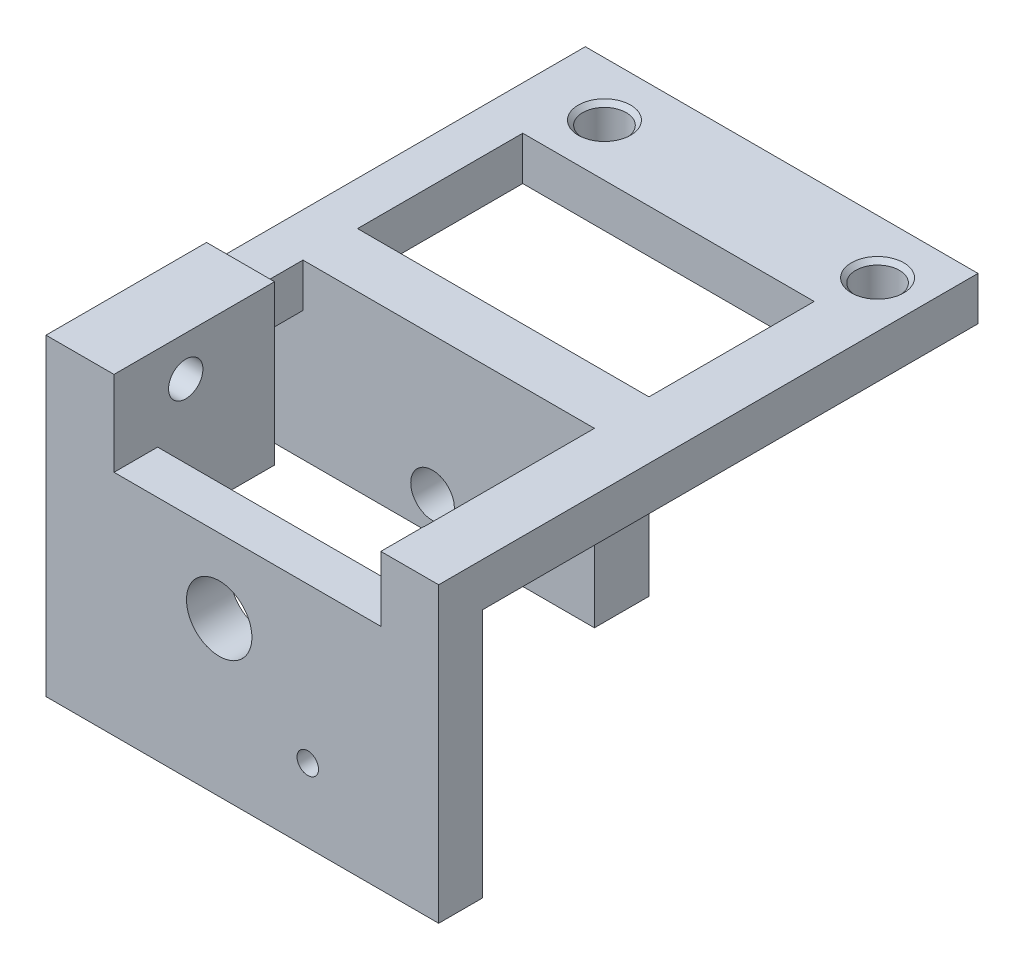
ISO-10303-21;
HEADER;
FILE_DESCRIPTION(('STEP AP214'),'2;1');
FILE_NAME('part.step','',(''),(''),'','','');
FILE_SCHEMA(('AUTOMOTIVE_DESIGN { 1 0 10303 214 1 1 1 1 }'));
ENDSEC;
DATA;
#1=APPLICATION_CONTEXT('core data for automotive mechanical design processes');
#2=APPLICATION_PROTOCOL_DEFINITION('international standard','automotive_design',2000,#1);
#3=PRODUCT_CONTEXT('',#1,'mechanical');
#4=PRODUCT('Part','Part','',(#3));
#5=PRODUCT_RELATED_PRODUCT_CATEGORY('part','',(#4));
#6=PRODUCT_DEFINITION_FORMATION('','',#4);
#7=PRODUCT_DEFINITION_CONTEXT('part definition',#1,'design');
#8=PRODUCT_DEFINITION('design','',#6,#7);
#9=PRODUCT_DEFINITION_SHAPE('','',#8);
#10=(LENGTH_UNIT() NAMED_UNIT(*) SI_UNIT(.MILLI.,.METRE.));
#11=(NAMED_UNIT(*) PLANE_ANGLE_UNIT() SI_UNIT($,.RADIAN.));
#12=(NAMED_UNIT(*) SI_UNIT($,.STERADIAN.) SOLID_ANGLE_UNIT());
#13=UNCERTAINTY_MEASURE_WITH_UNIT(LENGTH_MEASURE(1.E-05),#10,'distance_accuracy_value','');
#14=(GEOMETRIC_REPRESENTATION_CONTEXT(3) GLOBAL_UNCERTAINTY_ASSIGNED_CONTEXT((#13)) GLOBAL_UNIT_ASSIGNED_CONTEXT((#10,
#11,#12)) REPRESENTATION_CONTEXT('',''));
#15=CARTESIAN_POINT('',(0.,0.,0.));
#16=DIRECTION('',(0.,0.,1.));
#17=DIRECTION('',(1.,0.,0.));
#18=AXIS2_PLACEMENT_3D('',#15,#16,#17);
#19=CARTESIAN_POINT('',(-18.8578713163455,22.7197449567817,0.));
#20=DIRECTION('',(1.,0.,0.));
#21=DIRECTION('',(0.,0.,-1.));
#22=AXIS2_PLACEMENT_3D('',#19,#20,#21);
#23=PLANE('',#22);
#24=DIRECTION('',(0.,-1.,0.));
#25=VECTOR('',#24,1.);
#26=CARTESIAN_POINT('',(-18.8578713163455,22.7197449567817,-31.0499999999992));
#27=LINE('',#26,#25);
#28=CARTESIAN_POINT('',(-18.8578713163455,29.0697449567817,-31.0499999999992));
#29=VERTEX_POINT('',#28);
#30=CARTESIAN_POINT('',(-18.8578713163455,22.7197449567817,-31.0499999999992));
#31=VERTEX_POINT('',#30);
#32=EDGE_CURVE('E242',#29,#31,#27,.T.);
#33=ORIENTED_EDGE('',*,*,#32,.F.);
#34=DIRECTION('',(0.,0.,-1.));
#35=VECTOR('',#34,1.);
#36=CARTESIAN_POINT('',(-18.8578713163455,29.0697449567817,0.));
#37=LINE('',#36,#35);
#38=CARTESIAN_POINT('',(-18.8578713163455,29.0697449567817,-23.368));
#39=VERTEX_POINT('',#38);
#40=EDGE_CURVE('E313',#39,#29,#37,.T.);
#41=ORIENTED_EDGE('',*,*,#40,.F.);
#42=DIRECTION('',(0.,1.,0.));
#43=VECTOR('',#42,1.);
#44=CARTESIAN_POINT('',(-18.8578713163455,0.,-23.368));
#45=LINE('',#44,#43);
#46=CARTESIAN_POINT('',(-18.8578713163455,22.7197449567817,-23.368));
#47=VERTEX_POINT('',#46);
#48=EDGE_CURVE('E412',#47,#39,#45,.T.);
#49=ORIENTED_EDGE('',*,*,#48,.F.);
#50=DIRECTION('',(0.,0.,-1.));
#51=VECTOR('',#50,1.);
#52=CARTESIAN_POINT('',(-18.8578713163455,22.7197449567817,0.));
#53=LINE('',#52,#51);
#54=EDGE_CURVE('E304',#47,#31,#53,.T.);
#55=ORIENTED_EDGE('',*,*,#54,.T.);
#56=EDGE_LOOP('',(#33,#41,#49,#55));
#57=FACE_BOUND('',#56,.T.);
#58=ADVANCED_FACE('F37',(#57),#23,.T.);
#59=CARTESIAN_POINT('',(0.,22.7197449567817,0.));
#60=DIRECTION('',(0.,1.,0.));
#61=DIRECTION('',(0.,0.,1.));
#62=AXIS2_PLACEMENT_3D('',#59,#60,#61);
#63=PLANE('',#62);
#64=DIRECTION('',(0.,0.,1.));
#65=VECTOR('',#64,1.);
#66=CARTESIAN_POINT('',(-25.2078713163455,22.7197449567817,0.));
#67=LINE('',#66,#65);
#68=CARTESIAN_POINT('',(-25.2078713163455,22.7197449567817,-31.0499999999992));
#69=VERTEX_POINT('',#68);
#70=CARTESIAN_POINT('',(-25.2078713163455,22.7197449567817,-23.368));
#71=VERTEX_POINT('',#70);
#72=EDGE_CURVE('E307',#69,#71,#67,.T.);
#73=ORIENTED_EDGE('',*,*,#72,.F.);
#74=DIRECTION('',(1.,0.,0.));
#75=VECTOR('',#74,1.);
#76=CARTESIAN_POINT('',(0.,22.7197449567817,-31.0499999999992));
#77=LINE('',#76,#75);
#78=EDGE_CURVE('E239',#69,#31,#77,.T.);
#79=ORIENTED_EDGE('',*,*,#78,.T.);
#80=ORIENTED_EDGE('',*,*,#54,.F.);
#81=DIRECTION('',(-1.,0.,0.));
#82=VECTOR('',#81,1.);
#83=CARTESIAN_POINT('',(0.,22.7197449567817,-23.368));
#84=LINE('',#83,#82);
#85=EDGE_CURVE('E415',#47,#71,#84,.T.);
#86=ORIENTED_EDGE('',*,*,#85,.T.);
#87=EDGE_LOOP('',(#73,#79,#80,#86));
#88=FACE_BOUND('',#87,.T.);
#89=ADVANCED_FACE('F442',(#88),#63,.F.);
#90=CARTESIAN_POINT('',(23.5601286836545,22.7197449567817,0.));
#91=DIRECTION('',(-1.,0.,0.));
#92=DIRECTION('',(0.,0.,1.));
#93=AXIS2_PLACEMENT_3D('',#90,#91,#92);
#94=PLANE('',#93);
#95=DIRECTION('',(0.,1.,0.));
#96=VECTOR('',#95,1.);
#97=CARTESIAN_POINT('',(23.5601286836545,22.7197449567817,-31.0499999999993));
#98=LINE('',#97,#96);
#99=CARTESIAN_POINT('',(23.5601286836545,22.7197449567817,-31.0499999999993));
#100=VERTEX_POINT('',#99);
#101=CARTESIAN_POINT('',(23.5601286836545,29.0697449567817,-31.0499999999992));
#102=VERTEX_POINT('',#101);
#103=EDGE_CURVE('E11',#100,#102,#98,.T.);
#104=ORIENTED_EDGE('',*,*,#103,.F.);
#105=DIRECTION('',(0.,0.,1.));
#106=VECTOR('',#105,1.);
#107=CARTESIAN_POINT('',(23.5601286836545,22.7197449567817,0.));
#108=LINE('',#107,#106);
#109=CARTESIAN_POINT('',(23.5601286836545,22.7197449567817,-6.35));
#110=VERTEX_POINT('',#109);
#111=EDGE_CURVE('E289',#100,#110,#108,.T.);
#112=ORIENTED_EDGE('',*,*,#111,.T.);
#113=DIRECTION('',(0.,1.,0.));
#114=VECTOR('',#113,1.);
#115=CARTESIAN_POINT('',(23.5601286836545,0.,-6.35));
#116=LINE('',#115,#114);
#117=CARTESIAN_POINT('',(23.5601286836545,29.0697449567817,-6.35));
#118=VERTEX_POINT('',#117);
#119=EDGE_CURVE('E300',#110,#118,#116,.T.);
#120=ORIENTED_EDGE('',*,*,#119,.T.);
#121=DIRECTION('',(0.,0.,1.));
#122=VECTOR('',#121,1.);
#123=CARTESIAN_POINT('',(23.5601286836545,29.0697449567817,0.));
#124=LINE('',#123,#122);
#125=EDGE_CURVE('E286',#102,#118,#124,.T.);
#126=ORIENTED_EDGE('',*,*,#125,.F.);
#127=EDGE_LOOP('',(#104,#112,#120,#126));
#128=FACE_BOUND('',#127,.T.);
#129=ADVANCED_FACE('F449',(#128),#94,.T.);
#130=CARTESIAN_POINT('',(0.,0.,-23.368));
#131=DIRECTION('',(0.,0.,1.));
#132=DIRECTION('',(1.,0.,0.));
#133=AXIS2_PLACEMENT_3D('',#130,#131,#132);
#134=PLANE('',#133);
#135=ORIENTED_EDGE('',*,*,#85,.F.);
#136=ORIENTED_EDGE('',*,*,#48,.T.);
#137=DIRECTION('',(-1.,0.,0.));
#138=VECTOR('',#137,1.);
#139=CARTESIAN_POINT('',(0.,29.0697449567817,-23.368));
#140=LINE('',#139,#138);
#141=CARTESIAN_POINT('',(-25.2078713163455,29.0697449567817,-23.368));
#142=VERTEX_POINT('',#141);
#143=EDGE_CURVE('E392',#39,#142,#140,.T.);
#144=ORIENTED_EDGE('',*,*,#143,.T.);
#145=DIRECTION('',(0.,-1.,0.));
#146=VECTOR('',#145,1.);
#147=CARTESIAN_POINT('',(-25.2078713163455,0.,-23.368));
#148=LINE('',#147,#146);
#149=CARTESIAN_POINT('',(-25.2078713163455,31.9581967213115,-23.368));
#150=VERTEX_POINT('',#149);
#151=EDGE_CURVE('E325',#150,#142,#148,.T.);
#152=ORIENTED_EDGE('',*,*,#151,.F.);
#153=DIRECTION('',(-1.,0.,0.));
#154=VECTOR('',#153,1.);
#155=CARTESIAN_POINT('',(0.,31.9581967213115,-23.368));
#156=LINE('',#155,#154);
#157=CARTESIAN_POINT('',(-15.3109469053674,31.9581967213115,-23.368));
#158=VERTEX_POINT('',#157);
#159=EDGE_CURVE('E321',#158,#150,#156,.T.);
#160=ORIENTED_EDGE('',*,*,#159,.F.);
#161=DIRECTION('',(0.,-1.,0.));
#162=VECTOR('',#161,1.);
#163=CARTESIAN_POINT('',(-15.3109469053674,0.,-23.368));
#164=LINE('',#163,#162);
#165=CARTESIAN_POINT('',(-15.3109469053674,8.84419672131148,-23.368));
#166=VERTEX_POINT('',#165);
#167=EDGE_CURVE('E319',#158,#166,#164,.T.);
#168=ORIENTED_EDGE('',*,*,#167,.T.);
#169=DIRECTION('',(-1.,0.,0.));
#170=VECTOR('',#169,1.);
#171=CARTESIAN_POINT('',(0.,8.84419672131148,-23.368));
#172=LINE('',#171,#170);
#173=CARTESIAN_POINT('',(-25.2078713163455,8.84419672131148,-23.368));
#174=VERTEX_POINT('',#173);
#175=EDGE_CURVE('E312',#166,#174,#172,.T.);
#176=ORIENTED_EDGE('',*,*,#175,.T.);
#177=EDGE_CURVE('E324',#71,#174,#148,.T.);
#178=ORIENTED_EDGE('',*,*,#177,.F.);
#179=EDGE_LOOP('',(#135,#136,#144,#152,#160,#168,#176,#178));
#180=FACE_BOUND('',#179,.T.);
#181=ADVANCED_FACE('F546',(#180),#134,.F.);
#182=CARTESIAN_POINT('',(0.,0.,-6.35));
#183=DIRECTION('',(0.,0.,-1.));
#184=DIRECTION('',(-1.,0.,0.));
#185=AXIS2_PLACEMENT_3D('',#182,#183,#184);
#186=PLANE('',#185);
#187=ORIENTED_EDGE('',*,*,#119,.F.);
#188=DIRECTION('',(1.,0.,0.));
#189=VECTOR('',#188,1.);
#190=CARTESIAN_POINT('',(0.,22.7197449567817,-6.35));
#191=LINE('',#190,#189);
#192=CARTESIAN_POINT('',(31.9421286836545,22.7197449567817,-6.35));
#193=VERTEX_POINT('',#192);
#194=EDGE_CURVE('E294',#110,#193,#191,.T.);
#195=ORIENTED_EDGE('',*,*,#194,.T.);
#196=DIRECTION('',(0.,1.,0.));
#197=VECTOR('',#196,1.);
#198=CARTESIAN_POINT('',(31.9421286836545,29.0697449567817,-6.35));
#199=LINE('',#198,#197);
#200=CARTESIAN_POINT('',(31.9421286836545,-13.6022550432183,-6.35));
#201=VERTEX_POINT('',#200);
#202=EDGE_CURVE('E358',#201,#193,#199,.T.);
#203=ORIENTED_EDGE('',*,*,#202,.F.);
#204=DIRECTION('',(1.,0.,0.));
#205=VECTOR('',#204,1.);
#206=CARTESIAN_POINT('',(-25.2078713163455,-13.6022550432183,-6.35));
#207=LINE('',#206,#205);
#208=CARTESIAN_POINT('',(-25.2078713163455,-13.6022550432183,-6.35));
#209=VERTEX_POINT('',#208);
#210=EDGE_CURVE('E354',#209,#201,#207,.T.);
#211=ORIENTED_EDGE('',*,*,#210,.F.);
#212=DIRECTION('',(0.,-1.,0.));
#213=VECTOR('',#212,1.);
#214=CARTESIAN_POINT('',(-25.2078713163455,8.84419672131148,-6.35));
#215=LINE('',#214,#213);
#216=CARTESIAN_POINT('',(-25.2078713163455,8.84419672131148,-6.35));
#217=VERTEX_POINT('',#216);
#218=EDGE_CURVE('E352',#217,#209,#215,.T.);
#219=ORIENTED_EDGE('',*,*,#218,.F.);
#220=DIRECTION('',(1.,0.,0.));
#221=VECTOR('',#220,1.);
#222=CARTESIAN_POINT('',(0.,8.84419672131148,-6.35));
#223=LINE('',#222,#221);
#224=CARTESIAN_POINT('',(-15.3109469053674,8.84419672131148,-6.35));
#225=VERTEX_POINT('',#224);
#226=EDGE_CURVE('E336',#217,#225,#223,.T.);
#227=ORIENTED_EDGE('',*,*,#226,.T.);
#228=DIRECTION('',(0.,1.,0.));
#229=VECTOR('',#228,1.);
#230=CARTESIAN_POINT('',(-15.3109469053674,0.,-6.35));
#231=LINE('',#230,#229);
#232=CARTESIAN_POINT('',(-15.3109469053674,19.6202999936889,-6.35));
#233=VERTEX_POINT('',#232);
#234=EDGE_CURVE('E332',#225,#233,#231,.T.);
#235=ORIENTED_EDGE('',*,*,#234,.T.);
#236=DIRECTION('',(-1.,0.,0.));
#237=VECTOR('',#236,1.);
#238=CARTESIAN_POINT('',(-15.3109469053674,19.6202999936889,-6.35));
#239=LINE('',#238,#237);
#240=CARTESIAN_POINT('',(23.5226051795746,19.6202999936889,-6.35));
#241=VERTEX_POINT('',#240);
#242=EDGE_CURVE('E365',#241,#233,#239,.T.);
#243=ORIENTED_EDGE('',*,*,#242,.F.);
#244=DIRECTION('',(0.,-1.,0.));
#245=VECTOR('',#244,1.);
#246=CARTESIAN_POINT('',(23.5226051795746,22.6564717057016,-6.35));
#247=LINE('',#246,#245);
#248=CARTESIAN_POINT('',(23.5226051795746,29.0697449567817,-6.35));
#249=VERTEX_POINT('',#248);
#250=EDGE_CURVE('E363',#249,#241,#247,.T.);
#251=ORIENTED_EDGE('',*,*,#250,.F.);
#252=DIRECTION('',(-1.,0.,0.));
#253=VECTOR('',#252,1.);
#254=CARTESIAN_POINT('',(23.5226051795746,29.0697449567817,-6.35));
#255=LINE('',#254,#253);
#256=EDGE_CURVE('E361',#118,#249,#255,.T.);
#257=ORIENTED_EDGE('',*,*,#256,.F.);
#258=EDGE_LOOP('',(#187,#195,#203,#211,#219,#227,#235,#243,#251,#257));
#259=FACE_BOUND('',#258,.T.);
#260=CARTESIAN_POINT('',(6.65235973945633E-08,8.84419672131148,-6.35));
#261=DIRECTION('',(0.,0.,1.));
#262=DIRECTION('',(1.,0.,0.));
#263=AXIS2_PLACEMENT_3D('',#260,#261,#262);
#264=CIRCLE('',#263,4.76249999893999);
#265=CARTESIAN_POINT('',(4.76250006546358,8.84419672131148,-6.35));
#266=VERTEX_POINT('',#265);
#267=EDGE_CURVE('E340',#266,#266,#264,.T.);
#268=ORIENTED_EDGE('',*,*,#267,.T.);
#269=EDGE_LOOP('',(#268));
#270=FACE_BOUND('',#269,.T.);
#271=CARTESIAN_POINT('',(12.8921286836545,-2.93425504321831,-6.35));
#272=DIRECTION('',(0.,0.,1.));
#273=DIRECTION('',(1.,0.,0.));
#274=AXIS2_PLACEMENT_3D('',#271,#272,#273);
#275=CIRCLE('',#274,1.56147540877372);
#276=CARTESIAN_POINT('',(14.4536040924282,-2.93425504321831,-6.35));
#277=VERTEX_POINT('',#276);
#278=EDGE_CURVE('E346',#277,#277,#275,.T.);
#279=ORIENTED_EDGE('',*,*,#278,.T.);
#280=EDGE_LOOP('',(#279));
#281=FACE_BOUND('',#280,.T.);
#282=ADVANCED_FACE('F521',(#259,#270,#281),#186,.T.);
#283=CARTESIAN_POINT('',(-25.2078713163455,31.9581967213115,-6.35));
#284=DIRECTION('',(0.,1.,0.));
#285=DIRECTION('',(0.,0.,1.));
#286=AXIS2_PLACEMENT_3D('',#283,#284,#285);
#287=PLANE('',#286);
#288=DIRECTION('',(-1.,0.,0.));
#289=VECTOR('',#288,1.);
#290=CARTESIAN_POINT('',(-25.2078713163455,31.9581967213115,0.));
#291=LINE('',#290,#289);
#292=CARTESIAN_POINT('',(-15.3109469053674,31.9581967213115,0.));
#293=VERTEX_POINT('',#292);
#294=CARTESIAN_POINT('',(-25.2078713163455,31.9581967213115,0.));
#295=VERTEX_POINT('',#294);
#296=EDGE_CURVE('E355',#293,#295,#291,.T.);
#297=ORIENTED_EDGE('',*,*,#296,.F.);
#298=DIRECTION('',(0.,0.,1.));
#299=VECTOR('',#298,1.);
#300=CARTESIAN_POINT('',(-15.3109469053674,31.9581967213115,-6.35));
#301=LINE('',#300,#299);
#302=EDGE_CURVE('E393',#158,#293,#301,.T.);
#303=ORIENTED_EDGE('',*,*,#302,.F.);
#304=ORIENTED_EDGE('',*,*,#159,.T.);
#305=DIRECTION('',(0.,0.,1.));
#306=VECTOR('',#305,1.);
#307=CARTESIAN_POINT('',(-25.2078713163455,31.9581967213115,-6.35));
#308=LINE('',#307,#306);
#309=EDGE_CURVE('E389',#150,#295,#308,.T.);
#310=ORIENTED_EDGE('',*,*,#309,.T.);
#311=EDGE_LOOP('',(#297,#303,#304,#310));
#312=FACE_BOUND('',#311,.T.);
#313=ADVANCED_FACE('F541',(#312),#287,.T.);
#314=CARTESIAN_POINT('',(-15.3109469053674,31.9581967213115,-6.35));
#315=DIRECTION('',(1.,0.,0.));
#316=DIRECTION('',(0.,0.,-1.));
#317=AXIS2_PLACEMENT_3D('',#314,#315,#316);
#318=PLANE('',#317);
#319=CARTESIAN_POINT('',(-15.3109469053674,26.1623070820462,-10.4374991238568));
#320=DIRECTION('',(1.,0.,0.));
#321=DIRECTION('',(0.,0.,-1.));
#322=AXIS2_PLACEMENT_3D('',#319,#320,#321);
#323=CIRCLE('',#322,2.50000000000162);
#324=CARTESIAN_POINT('',(-15.3109469053674,26.1623070820462,-12.9374991238585));
#325=VERTEX_POINT('',#324);
#326=EDGE_CURVE('E280',#325,#325,#323,.F.);
#327=ORIENTED_EDGE('',*,*,#326,.T.);
#328=EDGE_LOOP('',(#327));
#329=FACE_BOUND('',#328,.T.);
#330=DIRECTION('',(0.,1.,0.));
#331=VECTOR('',#330,1.);
#332=CARTESIAN_POINT('',(-15.3109469053674,31.9581967213115,0.));
#333=LINE('',#332,#331);
#334=CARTESIAN_POINT('',(-15.3109469053674,19.6202999936889,0.));
#335=VERTEX_POINT('',#334);
#336=EDGE_CURVE('E384',#335,#293,#333,.T.);
#337=ORIENTED_EDGE('',*,*,#336,.F.);
#338=DIRECTION('',(0.,0.,1.));
#339=VECTOR('',#338,1.);
#340=CARTESIAN_POINT('',(-15.3109469053674,19.6202999936889,-6.35));
#341=LINE('',#340,#339);
#342=EDGE_CURVE('E396',#233,#335,#341,.T.);
#343=ORIENTED_EDGE('',*,*,#342,.F.);
#344=ORIENTED_EDGE('',*,*,#234,.F.);
#345=DIRECTION('',(0.,0.,1.));
#346=VECTOR('',#345,1.);
#347=CARTESIAN_POINT('',(-15.3109469053674,8.84419672131148,-23.368));
#348=LINE('',#347,#346);
#349=EDGE_CURVE('E328',#166,#225,#348,.T.);
#350=ORIENTED_EDGE('',*,*,#349,.F.);
#351=ORIENTED_EDGE('',*,*,#167,.F.);
#352=ORIENTED_EDGE('',*,*,#302,.T.);
#353=EDGE_LOOP('',(#337,#343,#344,#350,#351,#352));
#354=FACE_BOUND('',#353,.T.);
#355=ADVANCED_FACE('F536',(#329,#354),#318,.T.);
#356=CARTESIAN_POINT('',(-15.3109469053674,19.6202999936889,-6.35));
#357=DIRECTION('',(0.,1.,0.));
#358=DIRECTION('',(0.,0.,1.));
#359=AXIS2_PLACEMENT_3D('',#356,#357,#358);
#360=PLANE('',#359);
#361=DIRECTION('',(-1.,0.,0.));
#362=VECTOR('',#361,1.);
#363=CARTESIAN_POINT('',(-15.3109469053674,19.6202999936889,0.));
#364=LINE('',#363,#362);
#365=CARTESIAN_POINT('',(23.5226051795746,19.6202999936889,0.));
#366=VERTEX_POINT('',#365);
#367=EDGE_CURVE('E381',#366,#335,#364,.T.);
#368=ORIENTED_EDGE('',*,*,#367,.F.);
#369=DIRECTION('',(0.,0.,1.));
#370=VECTOR('',#369,1.);
#371=CARTESIAN_POINT('',(23.5226051795746,19.6202999936889,-6.35));
#372=LINE('',#371,#370);
#373=EDGE_CURVE('E399',#241,#366,#372,.T.);
#374=ORIENTED_EDGE('',*,*,#373,.F.);
#375=ORIENTED_EDGE('',*,*,#242,.T.);
#376=ORIENTED_EDGE('',*,*,#342,.T.);
#377=EDGE_LOOP('',(#368,#374,#375,#376));
#378=FACE_BOUND('',#377,.T.);
#379=ADVANCED_FACE('F498',(#378),#360,.T.);
#380=CARTESIAN_POINT('',(23.5226051795746,19.6202999936889,-6.35));
#381=DIRECTION('',(-1.,0.,0.));
#382=DIRECTION('',(0.,0.,1.));
#383=AXIS2_PLACEMENT_3D('',#380,#381,#382);
#384=PLANE('',#383);
#385=DIRECTION('',(0.,-1.,0.));
#386=VECTOR('',#385,1.);
#387=CARTESIAN_POINT('',(23.5226051795746,19.6202999936889,0.));
#388=LINE('',#387,#386);
#389=CARTESIAN_POINT('',(23.5226051795746,29.0697449567817,0.));
#390=VERTEX_POINT('',#389);
#391=EDGE_CURVE('E378',#390,#366,#388,.T.);
#392=ORIENTED_EDGE('',*,*,#391,.F.);
#393=DIRECTION('',(0.,0.,1.));
#394=VECTOR('',#393,1.);
#395=CARTESIAN_POINT('',(23.5226051795746,29.0697449567817,-6.35));
#396=LINE('',#395,#394);
#397=EDGE_CURVE('E401',#249,#390,#396,.T.);
#398=ORIENTED_EDGE('',*,*,#397,.F.);
#399=ORIENTED_EDGE('',*,*,#250,.T.);
#400=ORIENTED_EDGE('',*,*,#373,.T.);
#401=EDGE_LOOP('',(#392,#398,#399,#400));
#402=FACE_BOUND('',#401,.T.);
#403=ADVANCED_FACE('F484',(#402),#384,.T.);
#404=CARTESIAN_POINT('',(23.5226051795746,29.0697449567817,-6.35));
#405=DIRECTION('',(0.,1.,0.));
#406=DIRECTION('',(0.,0.,1.));
#407=AXIS2_PLACEMENT_3D('',#404,#405,#406);
#408=PLANE('',#407);
#409=DIRECTION('',(0.,0.,1.));
#410=VECTOR('',#409,1.);
#411=CARTESIAN_POINT('',(-25.2078713163455,29.0697449567817,0.));
#412=LINE('',#411,#410);
#413=CARTESIAN_POINT('',(-25.2078713163455,29.0697449567817,-78.4946062848162));
#414=VERTEX_POINT('',#413);
#415=EDGE_CURVE('E315',#414,#142,#412,.T.);
#416=ORIENTED_EDGE('',*,*,#415,.T.);
#417=ORIENTED_EDGE('',*,*,#143,.F.);
#418=ORIENTED_EDGE('',*,*,#40,.T.);
#419=DIRECTION('',(1.,0.,0.));
#420=VECTOR('',#419,1.);
#421=CARTESIAN_POINT('',(23.5601286836545,29.0697449567817,-31.0499999999993));
#422=LINE('',#421,#420);
#423=EDGE_CURVE('E60',#29,#102,#422,.T.);
#424=ORIENTED_EDGE('',*,*,#423,.T.);
#425=ORIENTED_EDGE('',*,*,#125,.T.);
#426=ORIENTED_EDGE('',*,*,#256,.T.);
#427=ORIENTED_EDGE('',*,*,#397,.T.);
#428=DIRECTION('',(-1.,0.,0.));
#429=VECTOR('',#428,1.);
#430=CARTESIAN_POINT('',(23.5226051795746,29.0697449567817,0.));
#431=LINE('',#430,#429);
#432=CARTESIAN_POINT('',(31.9421286836545,29.0697449567817,0.));
#433=VERTEX_POINT('',#432);
#434=EDGE_CURVE('E376',#433,#390,#431,.T.);
#435=ORIENTED_EDGE('',*,*,#434,.F.);
#436=DIRECTION('',(0.,0.,1.));
#437=VECTOR('',#436,1.);
#438=CARTESIAN_POINT('',(31.9421286836545,29.0697449567817,-6.35));
#439=LINE('',#438,#437);
#440=CARTESIAN_POINT('',(31.9421286836545,29.0697449567817,-78.4946062848162));
#441=VERTEX_POINT('',#440);
#442=EDGE_CURVE('E404',#441,#433,#439,.T.);
#443=ORIENTED_EDGE('',*,*,#442,.F.);
#444=DIRECTION('',(-1.,0.,0.));
#445=VECTOR('',#444,1.);
#446=CARTESIAN_POINT('',(-25.2078713163455,29.0697449567817,-78.4946062848162));
#447=LINE('',#446,#445);
#448=EDGE_CURVE('E261',#441,#414,#447,.T.);
#449=ORIENTED_EDGE('',*,*,#448,.T.);
#450=EDGE_LOOP('',(#416,#417,#418,#424,#425,#426,#427,#435,#443,#449));
#451=FACE_BOUND('',#450,.T.);
#452=DIRECTION('',(-1.,0.,0.));
#453=VECTOR('',#452,1.);
#454=CARTESIAN_POINT('',(-25.2078713163455,29.0697449567817,-38.9874999999992));
#455=LINE('',#454,#453);
#456=CARTESIAN_POINT('',(23.5601286836545,29.0697449567817,-38.9874999999992));
#457=VERTEX_POINT('',#456);
#458=CARTESIAN_POINT('',(-18.8578713163455,29.0697449567817,-38.9874999999992));
#459=VERTEX_POINT('',#458);
#460=EDGE_CURVE('E219',#457,#459,#455,.T.);
#461=ORIENTED_EDGE('',*,*,#460,.T.);
#462=CARTESIAN_POINT('',(-18.8578713163455,29.0697449567817,-63.0362559522957));
#463=VERTEX_POINT('',#462);
#464=EDGE_CURVE('E303',#459,#463,#37,.T.);
#465=ORIENTED_EDGE('',*,*,#464,.T.);
#466=DIRECTION('',(1.,0.,0.));
#467=VECTOR('',#466,1.);
#468=CARTESIAN_POINT('',(-25.2078713163455,29.0697449567817,-63.0362559522957));
#469=LINE('',#468,#467);
#470=CARTESIAN_POINT('',(23.5601286836545,29.0697449567817,-63.0362559522957));
#471=VERTEX_POINT('',#470);
#472=EDGE_CURVE('E265',#463,#471,#469,.T.);
#473=ORIENTED_EDGE('',*,*,#472,.T.);
#474=EDGE_CURVE('E290',#471,#457,#124,.T.);
#475=ORIENTED_EDGE('',*,*,#474,.T.);
#476=EDGE_LOOP('',(#461,#465,#473,#475));
#477=FACE_BOUND('',#476,.T.);
#478=CARTESIAN_POINT('',(-14.553595261809,29.0697449567817,-70.6252694501828));
#479=DIRECTION('',(0.,1.,0.));
#480=DIRECTION('',(0.,0.,1.));
#481=AXIS2_PLACEMENT_3D('',#478,#479,#480);
#482=CIRCLE('',#481,3.81);
#483=CARTESIAN_POINT('',(-14.553595261809,29.0697449567817,-66.8152694501828));
#484=VERTEX_POINT('',#483);
#485=EDGE_CURVE('E244',#484,#484,#482,.T.);
#486=ORIENTED_EDGE('',*,*,#485,.F.);
#487=EDGE_LOOP('',(#486));
#488=FACE_BOUND('',#487,.T.);
#489=CARTESIAN_POINT('',(25.195196690305,29.0697449567817,-70.6252694501828));
#490=DIRECTION('',(0.,1.,0.));
#491=DIRECTION('',(0.,0.,1.));
#492=AXIS2_PLACEMENT_3D('',#489,#490,#491);
#493=CIRCLE('',#492,3.81);
#494=CARTESIAN_POINT('',(25.195196690305,29.0697449567817,-66.8152694501828));
#495=VERTEX_POINT('',#494);
#496=EDGE_CURVE('E251',#495,#495,#493,.T.);
#497=ORIENTED_EDGE('',*,*,#496,.F.);
#498=EDGE_LOOP('',(#497));
#499=FACE_BOUND('',#498,.T.);
#500=ADVANCED_FACE('F480',(#451,#477,#488,#499),#408,.T.);
#501=CARTESIAN_POINT('',(31.9421286836545,29.0697449567817,-6.35));
#502=DIRECTION('',(1.,0.,0.));
#503=DIRECTION('',(0.,1.,0.));
#504=AXIS2_PLACEMENT_3D('',#501,#502,#503);
#505=PLANE('',#504);
#506=DIRECTION('',(0.,0.,-1.));
#507=VECTOR('',#506,1.);
#508=CARTESIAN_POINT('',(31.9421286836545,22.7197449567817,0.));
#509=LINE('',#508,#507);
#510=CARTESIAN_POINT('',(31.9421286836545,22.7197449567817,-78.4946062848162));
#511=VERTEX_POINT('',#510);
#512=EDGE_CURVE('E287',#193,#511,#509,.T.);
#513=ORIENTED_EDGE('',*,*,#512,.T.);
#514=DIRECTION('',(0.,1.,0.));
#515=VECTOR('',#514,1.);
#516=CARTESIAN_POINT('',(31.9421286836545,22.7197449567817,-78.4946062848162));
#517=LINE('',#516,#515);
#518=EDGE_CURVE('E264',#511,#441,#517,.T.);
#519=ORIENTED_EDGE('',*,*,#518,.T.);
#520=ORIENTED_EDGE('',*,*,#442,.T.);
#521=DIRECTION('',(0.,1.,0.));
#522=VECTOR('',#521,1.);
#523=CARTESIAN_POINT('',(31.9421286836545,29.0697449567817,0.));
#524=LINE('',#523,#522);
#525=CARTESIAN_POINT('',(31.9421286836545,-13.6022550432183,0.));
#526=VERTEX_POINT('',#525);
#527=EDGE_CURVE('E373',#526,#433,#524,.T.);
#528=ORIENTED_EDGE('',*,*,#527,.F.);
#529=DIRECTION('',(0.,0.,1.));
#530=VECTOR('',#529,1.);
#531=CARTESIAN_POINT('',(31.9421286836545,-13.6022550432183,-6.35));
#532=LINE('',#531,#530);
#533=EDGE_CURVE('E406',#201,#526,#532,.T.);
#534=ORIENTED_EDGE('',*,*,#533,.F.);
#535=ORIENTED_EDGE('',*,*,#202,.T.);
#536=EDGE_LOOP('',(#513,#519,#520,#528,#534,#535));
#537=FACE_BOUND('',#536,.T.);
#538=ADVANCED_FACE('F483',(#537),#505,.T.);
#539=CARTESIAN_POINT('',(-25.2078713163455,-13.6022550432183,-6.35));
#540=DIRECTION('',(0.,-1.,0.));
#541=DIRECTION('',(1.,0.,0.));
#542=AXIS2_PLACEMENT_3D('',#539,#540,#541);
#543=PLANE('',#542);
#544=DIRECTION('',(1.,0.,0.));
#545=VECTOR('',#544,1.);
#546=CARTESIAN_POINT('',(-25.2078713163455,-13.6022550432183,0.));
#547=LINE('',#546,#545);
#548=CARTESIAN_POINT('',(-25.2078713163455,-13.6022550432183,0.));
#549=VERTEX_POINT('',#548);
#550=EDGE_CURVE('E370',#549,#526,#547,.T.);
#551=ORIENTED_EDGE('',*,*,#550,.F.);
#552=DIRECTION('',(0.,0.,1.));
#553=VECTOR('',#552,1.);
#554=CARTESIAN_POINT('',(-25.2078713163455,-13.6022550432183,-6.35));
#555=LINE('',#554,#553);
#556=EDGE_CURVE('E368',#209,#549,#555,.T.);
#557=ORIENTED_EDGE('',*,*,#556,.F.);
#558=ORIENTED_EDGE('',*,*,#210,.T.);
#559=ORIENTED_EDGE('',*,*,#533,.T.);
#560=EDGE_LOOP('',(#551,#557,#558,#559));
#561=FACE_BOUND('',#560,.T.);
#562=ADVANCED_FACE('F495',(#561),#543,.T.);
#563=CARTESIAN_POINT('',(-25.2078713163455,8.84419672131148,-6.35));
#564=DIRECTION('',(-1.,0.,0.));
#565=DIRECTION('',(0.,-1.,0.));
#566=AXIS2_PLACEMENT_3D('',#563,#564,#565);
#567=PLANE('',#566);
#568=CARTESIAN_POINT('',(-25.2078713163455,22.7197449567817,-78.4946062848162));
#569=VERTEX_POINT('',#568);
#570=CARTESIAN_POINT('',(-25.2078713163455,22.7197449567817,-38.9874999999992));
#571=VERTEX_POINT('',#570);
#572=EDGE_CURVE('E309',#569,#571,#67,.T.);
#573=ORIENTED_EDGE('',*,*,#572,.T.);
#574=DIRECTION('',(0.,1.,0.));
#575=VECTOR('',#574,1.);
#576=CARTESIAN_POINT('',(-25.2078713163455,3.92374495678167,-38.9874999999992));
#577=LINE('',#576,#575);
#578=CARTESIAN_POINT('',(-25.2078713163455,3.92374495678167,-38.9874999999992));
#579=VERTEX_POINT('',#578);
#580=EDGE_CURVE('E52',#579,#571,#577,.T.);
#581=ORIENTED_EDGE('',*,*,#580,.F.);
#582=DIRECTION('',(0.,0.,1.));
#583=VECTOR('',#582,1.);
#584=CARTESIAN_POINT('',(-25.2078713163455,3.92374495678167,-38.9874999999992));
#585=LINE('',#584,#583);
#586=CARTESIAN_POINT('',(-25.2078713163455,3.92374495678167,-31.0499999999992));
#587=VERTEX_POINT('',#586);
#588=EDGE_CURVE('E213',#579,#587,#585,.T.);
#589=ORIENTED_EDGE('',*,*,#588,.T.);
#590=DIRECTION('',(0.,1.,0.));
#591=VECTOR('',#590,1.);
#592=CARTESIAN_POINT('',(-25.2078713163455,3.92374495678167,-31.0499999999992));
#593=LINE('',#592,#591);
#594=EDGE_CURVE('E232',#587,#69,#593,.T.);
#595=ORIENTED_EDGE('',*,*,#594,.T.);
#596=ORIENTED_EDGE('',*,*,#72,.T.);
#597=ORIENTED_EDGE('',*,*,#177,.T.);
#598=DIRECTION('',(0.,0.,1.));
#599=VECTOR('',#598,1.);
#600=CARTESIAN_POINT('',(-25.2078713163455,8.84419672131148,-23.368));
#601=LINE('',#600,#599);
#602=EDGE_CURVE('E329',#174,#217,#601,.T.);
#603=ORIENTED_EDGE('',*,*,#602,.T.);
#604=ORIENTED_EDGE('',*,*,#218,.T.);
#605=ORIENTED_EDGE('',*,*,#556,.T.);
#606=DIRECTION('',(0.,-1.,0.));
#607=VECTOR('',#606,1.);
#608=CARTESIAN_POINT('',(-25.2078713163455,8.84419672131148,0.));
#609=LINE('',#608,#607);
#610=EDGE_CURVE('E349',#295,#549,#609,.T.);
#611=ORIENTED_EDGE('',*,*,#610,.F.);
#612=ORIENTED_EDGE('',*,*,#309,.F.);
#613=ORIENTED_EDGE('',*,*,#151,.T.);
#614=ORIENTED_EDGE('',*,*,#415,.F.);
#615=DIRECTION('',(0.,1.,0.));
#616=VECTOR('',#615,1.);
#617=CARTESIAN_POINT('',(-25.2078713163455,22.7197449567817,-78.4946062848162));
#618=LINE('',#617,#616);
#619=EDGE_CURVE('E270',#569,#414,#618,.T.);
#620=ORIENTED_EDGE('',*,*,#619,.F.);
#621=EDGE_LOOP('',(#573,#581,#589,#595,#596,#597,#603,#604,#605,#611,#612,#613,#614,#620));
#622=FACE_BOUND('',#621,.T.);
#623=CARTESIAN_POINT('',(-25.2078713163455,26.1623070820463,-10.4374991238568));
#624=DIRECTION('',(-1.,0.,0.));
#625=DIRECTION('',(0.,-1.,0.));
#626=AXIS2_PLACEMENT_3D('',#623,#624,#625);
#627=CIRCLE('',#626,2.50000000000162);
#628=CARTESIAN_POINT('',(-25.2078713163455,23.6623070820446,-10.4374991238568));
#629=VERTEX_POINT('',#628);
#630=EDGE_CURVE('E283',#629,#629,#627,.T.);
#631=ORIENTED_EDGE('',*,*,#630,.F.);
#632=EDGE_LOOP('',(#631));
#633=FACE_BOUND('',#632,.T.);
#634=ADVANCED_FACE('F39',(#622,#633),#567,.T.);
#635=CARTESIAN_POINT('',(0.,0.,0.));
#636=DIRECTION('',(0.,0.,-1.));
#637=DIRECTION('',(-1.,0.,0.));
#638=AXIS2_PLACEMENT_3D('',#635,#636,#637);
#639=PLANE('',#638);
#640=ORIENTED_EDGE('',*,*,#434,.T.);
#641=ORIENTED_EDGE('',*,*,#391,.T.);
#642=ORIENTED_EDGE('',*,*,#367,.T.);
#643=ORIENTED_EDGE('',*,*,#336,.T.);
#644=ORIENTED_EDGE('',*,*,#296,.T.);
#645=ORIENTED_EDGE('',*,*,#610,.T.);
#646=ORIENTED_EDGE('',*,*,#550,.T.);
#647=ORIENTED_EDGE('',*,*,#527,.T.);
#648=EDGE_LOOP('',(#640,#641,#642,#643,#644,#645,#646,#647));
#649=FACE_BOUND('',#648,.T.);
#650=CARTESIAN_POINT('',(6.65235973945633E-08,8.84419672131148,0.));
#651=DIRECTION('',(0.,0.,1.));
#652=DIRECTION('',(1.,0.,0.));
#653=AXIS2_PLACEMENT_3D('',#650,#651,#652);
#654=CIRCLE('',#653,4.76249999893999);
#655=CARTESIAN_POINT('',(4.76250006546358,8.84419672131148,0.));
#656=VERTEX_POINT('',#655);
#657=EDGE_CURVE('E339',#656,#656,#654,.T.);
#658=ORIENTED_EDGE('',*,*,#657,.F.);
#659=EDGE_LOOP('',(#658));
#660=FACE_BOUND('',#659,.T.);
#661=CARTESIAN_POINT('',(12.8921286836545,-2.93425504321831,0.));
#662=DIRECTION('',(0.,0.,1.));
#663=DIRECTION('',(1.,0.,0.));
#664=AXIS2_PLACEMENT_3D('',#661,#662,#663);
#665=CIRCLE('',#664,1.56147540877372);
#666=CARTESIAN_POINT('',(14.4536040924282,-2.93425504321831,0.));
#667=VERTEX_POINT('',#666);
#668=EDGE_CURVE('E343',#667,#667,#665,.T.);
#669=ORIENTED_EDGE('',*,*,#668,.F.);
#670=EDGE_LOOP('',(#669));
#671=FACE_BOUND('',#670,.T.);
#672=ADVANCED_FACE('F507',(#649,#660,#671),#639,.F.);
#673=CARTESIAN_POINT('',(12.8921286836545,-2.93425504321831,-6.35));
#674=DIRECTION('',(0.,0.,1.));
#675=DIRECTION('',(1.,0.,0.));
#676=AXIS2_PLACEMENT_3D('',#673,#674,#675);
#677=CYLINDRICAL_SURFACE('',#676,1.56147540877372);
#678=ORIENTED_EDGE('',*,*,#278,.F.);
#679=EDGE_LOOP('',(#678));
#680=FACE_BOUND('',#679,.T.);
#681=ORIENTED_EDGE('',*,*,#668,.T.);
#682=EDGE_LOOP('',(#681));
#683=FACE_BOUND('',#682,.T.);
#684=ADVANCED_FACE('F587',(#680,#683),#677,.F.);
#685=CARTESIAN_POINT('',(6.65235973945633E-08,8.84419672131148,-6.35));
#686=DIRECTION('',(0.,0.,1.));
#687=DIRECTION('',(1.,0.,0.));
#688=AXIS2_PLACEMENT_3D('',#685,#686,#687);
#689=CYLINDRICAL_SURFACE('',#688,4.76249999893999);
#690=ORIENTED_EDGE('',*,*,#267,.F.);
#691=EDGE_LOOP('',(#690));
#692=FACE_BOUND('',#691,.T.);
#693=ORIENTED_EDGE('',*,*,#657,.T.);
#694=EDGE_LOOP('',(#693));
#695=FACE_BOUND('',#694,.T.);
#696=ADVANCED_FACE('F463',(#692,#695),#689,.F.);
#697=CARTESIAN_POINT('',(0.,8.84419672131148,-23.368));
#698=DIRECTION('',(0.,1.,0.));
#699=DIRECTION('',(-1.,0.,0.));
#700=AXIS2_PLACEMENT_3D('',#697,#698,#699);
#701=PLANE('',#700);
#702=ORIENTED_EDGE('',*,*,#226,.F.);
#703=ORIENTED_EDGE('',*,*,#602,.F.);
#704=ORIENTED_EDGE('',*,*,#175,.F.);
#705=ORIENTED_EDGE('',*,*,#349,.T.);
#706=EDGE_LOOP('',(#702,#703,#704,#705));
#707=FACE_BOUND('',#706,.T.);
#708=ADVANCED_FACE('F456',(#707),#701,.F.);
#709=DIRECTION('',(0.,1.,0.));
#710=VECTOR('',#709,1.);
#711=CARTESIAN_POINT('',(-18.8578713163455,22.7197449567817,-38.9874999999992));
#712=LINE('',#711,#710);
#713=CARTESIAN_POINT('',(-18.8578713163455,22.7197449567817,-38.9874999999992));
#714=VERTEX_POINT('',#713);
#715=EDGE_CURVE('E237',#714,#459,#712,.T.);
#716=ORIENTED_EDGE('',*,*,#715,.F.);
#717=CARTESIAN_POINT('',(-18.8578713163455,22.7197449567817,-63.0362559522957));
#718=VERTEX_POINT('',#717);
#719=EDGE_CURVE('E308',#714,#718,#53,.T.);
#720=ORIENTED_EDGE('',*,*,#719,.T.);
#721=DIRECTION('',(0.,-1.,0.));
#722=VECTOR('',#721,1.);
#723=CARTESIAN_POINT('',(-18.8578713163455,22.7197449567817,-63.0362559522957));
#724=LINE('',#723,#722);
#725=EDGE_CURVE('E277',#463,#718,#724,.T.);
#726=ORIENTED_EDGE('',*,*,#725,.F.);
#727=ORIENTED_EDGE('',*,*,#464,.F.);
#728=EDGE_LOOP('',(#716,#720,#726,#727));
#729=FACE_BOUND('',#728,.T.);
#730=ADVANCED_FACE('F445',(#729),#23,.T.);
#731=CARTESIAN_POINT('',(-14.553595261809,22.7197449567817,-70.6252694501828));
#732=DIRECTION('',(0.,1.,0.));
#733=DIRECTION('',(0.,0.,1.));
#734=AXIS2_PLACEMENT_3D('',#731,#732,#733);
#735=CIRCLE('',#734,3.175);
#736=CARTESIAN_POINT('',(-14.553595261809,22.7197449567817,-67.4502694501828));
#737=VERTEX_POINT('',#736);
#738=EDGE_CURVE('E250',#737,#737,#735,.T.);
#739=ORIENTED_EDGE('',*,*,#738,.T.);
#740=EDGE_LOOP('',(#739));
#741=FACE_BOUND('',#740,.T.);
#742=CARTESIAN_POINT('',(25.195196690305,22.7197449567817,-70.6252694501828));
#743=DIRECTION('',(0.,1.,0.));
#744=DIRECTION('',(0.,0.,1.));
#745=AXIS2_PLACEMENT_3D('',#742,#743,#744);
#746=CIRCLE('',#745,3.175);
#747=CARTESIAN_POINT('',(25.195196690305,22.7197449567817,-67.4502694501828));
#748=VERTEX_POINT('',#747);
#749=EDGE_CURVE('E257',#748,#748,#746,.T.);
#750=ORIENTED_EDGE('',*,*,#749,.T.);
#751=EDGE_LOOP('',(#750));
#752=FACE_BOUND('',#751,.T.);
#753=ORIENTED_EDGE('',*,*,#719,.F.);
#754=DIRECTION('',(-1.,0.,0.));
#755=VECTOR('',#754,1.);
#756=CARTESIAN_POINT('',(0.,22.7197449567817,-38.9874999999992));
#757=LINE('',#756,#755);
#758=EDGE_CURVE('E231',#714,#571,#757,.T.);
#759=ORIENTED_EDGE('',*,*,#758,.T.);
#760=ORIENTED_EDGE('',*,*,#572,.F.);
#761=DIRECTION('',(-1.,0.,0.));
#762=VECTOR('',#761,1.);
#763=CARTESIAN_POINT('',(-25.2078713163455,22.7197449567817,-78.4946062848162));
#764=LINE('',#763,#762);
#765=EDGE_CURVE('E260',#511,#569,#764,.T.);
#766=ORIENTED_EDGE('',*,*,#765,.F.);
#767=ORIENTED_EDGE('',*,*,#512,.F.);
#768=ORIENTED_EDGE('',*,*,#194,.F.);
#769=ORIENTED_EDGE('',*,*,#111,.F.);
#770=CARTESIAN_POINT('',(23.5601286836545,22.7197449567817,-38.9874999999992));
#771=VERTEX_POINT('',#770);
#772=EDGE_CURVE('E295',#771,#100,#108,.T.);
#773=ORIENTED_EDGE('',*,*,#772,.F.);
#774=CARTESIAN_POINT('',(23.5601286836545,22.7197449567817,-63.0362559522957));
#775=VERTEX_POINT('',#774);
#776=EDGE_CURVE('E291',#775,#771,#108,.T.);
#777=ORIENTED_EDGE('',*,*,#776,.F.);
#778=DIRECTION('',(1.,0.,0.));
#779=VECTOR('',#778,1.);
#780=CARTESIAN_POINT('',(-25.2078713163455,22.7197449567817,-63.0362559522957));
#781=LINE('',#780,#779);
#782=EDGE_CURVE('E258',#718,#775,#781,.T.);
#783=ORIENTED_EDGE('',*,*,#782,.F.);
#784=EDGE_LOOP('',(#753,#759,#760,#766,#767,#768,#769,#773,#777,#783));
#785=FACE_BOUND('',#784,.T.);
#786=ADVANCED_FACE('F423',(#741,#752,#785),#63,.F.);
#787=DIRECTION('',(0.,-1.,0.));
#788=VECTOR('',#787,1.);
#789=CARTESIAN_POINT('',(23.5601286836545,22.7197449567817,-38.9874999999992));
#790=LINE('',#789,#788);
#791=EDGE_CURVE('E45',#457,#771,#790,.T.);
#792=ORIENTED_EDGE('',*,*,#791,.F.);
#793=ORIENTED_EDGE('',*,*,#474,.F.);
#794=DIRECTION('',(0.,1.,0.));
#795=VECTOR('',#794,1.);
#796=CARTESIAN_POINT('',(23.5601286836545,22.7197449567817,-63.0362559522957));
#797=LINE('',#796,#795);
#798=EDGE_CURVE('E273',#775,#471,#797,.T.);
#799=ORIENTED_EDGE('',*,*,#798,.F.);
#800=ORIENTED_EDGE('',*,*,#776,.T.);
#801=EDGE_LOOP('',(#792,#793,#799,#800));
#802=FACE_BOUND('',#801,.T.);
#803=ADVANCED_FACE('F462',(#802),#94,.T.);
#804=CARTESIAN_POINT('',(31.9431286836545,26.1623070820462,-10.4374991238568));
#805=DIRECTION('',(-1.,0.,0.));
#806=DIRECTION('',(0.,-1.,0.));
#807=AXIS2_PLACEMENT_3D('',#804,#805,#806);
#808=CYLINDRICAL_SURFACE('',#807,2.50000000000162);
#809=ORIENTED_EDGE('',*,*,#326,.F.);
#810=EDGE_LOOP('',(#809));
#811=FACE_BOUND('',#810,.T.);
#812=ORIENTED_EDGE('',*,*,#630,.T.);
#813=EDGE_LOOP('',(#812));
#814=FACE_BOUND('',#813,.T.);
#815=ADVANCED_FACE('F563',(#811,#814),#808,.F.);
#816=CARTESIAN_POINT('',(-25.2078713163455,22.7197449567817,-78.4946062848162));
#817=DIRECTION('',(0.,0.,-1.));
#818=DIRECTION('',(-1.,0.,0.));
#819=AXIS2_PLACEMENT_3D('',#816,#817,#818);
#820=PLANE('',#819);
#821=ORIENTED_EDGE('',*,*,#448,.F.);
#822=ORIENTED_EDGE('',*,*,#518,.F.);
#823=ORIENTED_EDGE('',*,*,#765,.T.);
#824=ORIENTED_EDGE('',*,*,#619,.T.);
#825=EDGE_LOOP('',(#821,#822,#823,#824));
#826=FACE_BOUND('',#825,.T.);
#827=ADVANCED_FACE('F561',(#826),#820,.T.);
#828=CARTESIAN_POINT('',(-25.2078713163455,22.7197449567817,-63.0362559522957));
#829=DIRECTION('',(0.,0.,1.));
#830=DIRECTION('',(1.,0.,0.));
#831=AXIS2_PLACEMENT_3D('',#828,#829,#830);
#832=PLANE('',#831);
#833=ORIENTED_EDGE('',*,*,#472,.F.);
#834=ORIENTED_EDGE('',*,*,#725,.T.);
#835=ORIENTED_EDGE('',*,*,#782,.T.);
#836=ORIENTED_EDGE('',*,*,#798,.T.);
#837=EDGE_LOOP('',(#833,#834,#835,#836));
#838=FACE_BOUND('',#837,.T.);
#839=ADVANCED_FACE('F476',(#838),#832,.T.);
#840=CARTESIAN_POINT('',(25.195196690305,29.0697449567817,-70.6252694501828));
#841=DIRECTION('',(0.,1.,0.));
#842=DIRECTION('',(0.,0.,1.));
#843=AXIS2_PLACEMENT_3D('',#840,#841,#842);
#844=CYLINDRICAL_SURFACE('',#843,3.175);
#845=CARTESIAN_POINT('',(25.195196690305,28.4347449567817,-70.6252694501828));
#846=DIRECTION('',(0.,1.,0.));
#847=DIRECTION('',(0.,0.,1.));
#848=AXIS2_PLACEMENT_3D('',#845,#846,#847);
#849=CIRCLE('',#848,3.175);
#850=CARTESIAN_POINT('',(25.195196690305,28.4347449567817,-67.4502694501828));
#851=VERTEX_POINT('',#850);
#852=EDGE_CURVE('E254',#851,#851,#849,.T.);
#853=ORIENTED_EDGE('',*,*,#852,.T.);
#854=EDGE_LOOP('',(#853));
#855=FACE_BOUND('',#854,.T.);
#856=ORIENTED_EDGE('',*,*,#749,.F.);
#857=EDGE_LOOP('',(#856));
#858=FACE_BOUND('',#857,.T.);
#859=ADVANCED_FACE('F438',(#855,#858),#844,.F.);
#860=CARTESIAN_POINT('',(25.195196690305,29.0697449567817,-70.6252694501828));
#861=DIRECTION('',(0.,1.,0.));
#862=DIRECTION('',(0.,0.,1.));
#863=AXIS2_PLACEMENT_3D('',#860,#861,#862);
#864=CONICAL_SURFACE('',#863,3.81,0.785398163397448);
#865=ORIENTED_EDGE('',*,*,#852,.F.);
#866=EDGE_LOOP('',(#865));
#867=FACE_BOUND('',#866,.T.);
#868=ORIENTED_EDGE('',*,*,#496,.T.);
#869=EDGE_LOOP('',(#868));
#870=FACE_BOUND('',#869,.T.);
#871=ADVANCED_FACE('F429',(#867,#870),#864,.F.);
#872=CARTESIAN_POINT('',(-14.553595261809,29.0697449567817,-70.6252694501828));
#873=DIRECTION('',(0.,1.,0.));
#874=DIRECTION('',(0.,0.,1.));
#875=AXIS2_PLACEMENT_3D('',#872,#873,#874);
#876=CYLINDRICAL_SURFACE('',#875,3.175);
#877=CARTESIAN_POINT('',(-14.553595261809,28.4347449567817,-70.6252694501828));
#878=DIRECTION('',(0.,1.,0.));
#879=DIRECTION('',(0.,0.,1.));
#880=AXIS2_PLACEMENT_3D('',#877,#878,#879);
#881=CIRCLE('',#880,3.175);
#882=CARTESIAN_POINT('',(-14.553595261809,28.4347449567817,-67.4502694501828));
#883=VERTEX_POINT('',#882);
#884=EDGE_CURVE('E247',#883,#883,#881,.T.);
#885=ORIENTED_EDGE('',*,*,#884,.T.);
#886=EDGE_LOOP('',(#885));
#887=FACE_BOUND('',#886,.T.);
#888=ORIENTED_EDGE('',*,*,#738,.F.);
#889=EDGE_LOOP('',(#888));
#890=FACE_BOUND('',#889,.T.);
#891=ADVANCED_FACE('F426',(#887,#890),#876,.F.);
#892=CARTESIAN_POINT('',(-14.553595261809,29.0697449567817,-70.6252694501828));
#893=DIRECTION('',(0.,1.,0.));
#894=DIRECTION('',(0.,0.,1.));
#895=AXIS2_PLACEMENT_3D('',#892,#893,#894);
#896=CONICAL_SURFACE('',#895,3.81,0.785398163397446);
#897=ORIENTED_EDGE('',*,*,#884,.F.);
#898=EDGE_LOOP('',(#897));
#899=FACE_BOUND('',#898,.T.);
#900=ORIENTED_EDGE('',*,*,#485,.T.);
#901=EDGE_LOOP('',(#900));
#902=FACE_BOUND('',#901,.T.);
#903=ADVANCED_FACE('F428',(#899,#902),#896,.F.);
#904=CARTESIAN_POINT('',(23.5601286836545,3.92374495678167,-38.9874999999992));
#905=DIRECTION('',(1.,0.,0.));
#906=DIRECTION('',(0.,0.,-1.));
#907=AXIS2_PLACEMENT_3D('',#904,#905,#906);
#908=PLANE('',#907);
#909=ORIENTED_EDGE('',*,*,#772,.T.);
#910=DIRECTION('',(0.,1.,0.));
#911=VECTOR('',#910,1.);
#912=CARTESIAN_POINT('',(23.5601286836545,3.92374495678167,-31.0499999999993));
#913=LINE('',#912,#911);
#914=CARTESIAN_POINT('',(23.5601286836545,3.92374495678167,-31.0499999999993));
#915=VERTEX_POINT('',#914);
#916=EDGE_CURVE('E217',#915,#100,#913,.T.);
#917=ORIENTED_EDGE('',*,*,#916,.F.);
#918=DIRECTION('',(0.,0.,-1.));
#919=VECTOR('',#918,1.);
#920=CARTESIAN_POINT('',(23.5601286836545,3.92374495678167,-38.9874999999992));
#921=LINE('',#920,#919);
#922=CARTESIAN_POINT('',(23.5601286836545,3.92374495678167,-38.9874999999992));
#923=VERTEX_POINT('',#922);
#924=EDGE_CURVE('E210',#915,#923,#921,.T.);
#925=ORIENTED_EDGE('',*,*,#924,.T.);
#926=DIRECTION('',(0.,1.,0.));
#927=VECTOR('',#926,1.);
#928=CARTESIAN_POINT('',(23.5601286836545,3.92374495678167,-38.9874999999992));
#929=LINE('',#928,#927);
#930=EDGE_CURVE('E195',#923,#771,#929,.T.);
#931=ORIENTED_EDGE('',*,*,#930,.T.);
#932=EDGE_LOOP('',(#909,#917,#925,#931));
#933=FACE_BOUND('',#932,.T.);
#934=ADVANCED_FACE('F215',(#933),#908,.T.);
#935=CARTESIAN_POINT('',(23.5601286836545,3.92374495678167,-31.0499999999993));
#936=DIRECTION('',(0.,0.,1.));
#937=DIRECTION('',(1.,0.,0.));
#938=AXIS2_PLACEMENT_3D('',#935,#936,#937);
#939=PLANE('',#938);
#940=CARTESIAN_POINT('',(6.65236199459684E-08,8.8441967213108,-31.0499999999992));
#941=DIRECTION('',(0.,0.,1.));
#942=DIRECTION('',(1.,0.,0.));
#943=AXIS2_PLACEMENT_3D('',#940,#941,#942);
#944=CIRCLE('',#943,3.17500000000021);
#945=CARTESIAN_POINT('',(3.17500006652383,8.8441967213108,-31.0499999999992));
#946=VERTEX_POINT('',#945);
#947=EDGE_CURVE('E222',#946,#946,#944,.F.);
#948=ORIENTED_EDGE('',*,*,#947,.T.);
#949=EDGE_LOOP('',(#948));
#950=FACE_BOUND('',#949,.T.);
#951=ORIENTED_EDGE('',*,*,#423,.F.);
#952=ORIENTED_EDGE('',*,*,#32,.T.);
#953=ORIENTED_EDGE('',*,*,#78,.F.);
#954=ORIENTED_EDGE('',*,*,#594,.F.);
#955=DIRECTION('',(1.,0.,0.));
#956=VECTOR('',#955,1.);
#957=CARTESIAN_POINT('',(23.5601286836545,3.92374495678167,-31.0499999999993));
#958=LINE('',#957,#956);
#959=EDGE_CURVE('E203',#587,#915,#958,.T.);
#960=ORIENTED_EDGE('',*,*,#959,.T.);
#961=ORIENTED_EDGE('',*,*,#916,.T.);
#962=ORIENTED_EDGE('',*,*,#103,.T.);
#963=EDGE_LOOP('',(#951,#952,#953,#954,#960,#961,#962));
#964=FACE_BOUND('',#963,.T.);
#965=ADVANCED_FACE('F550',(#950,#964),#939,.T.);
#966=CARTESIAN_POINT('',(-25.2078713163455,3.92374495678167,-38.9874999999992));
#967=DIRECTION('',(0.,0.,-1.));
#968=DIRECTION('',(-1.,0.,0.));
#969=AXIS2_PLACEMENT_3D('',#966,#967,#968);
#970=PLANE('',#969);
#971=CARTESIAN_POINT('',(6.65236199459684E-08,8.8441967213108,-38.9874999999992));
#972=DIRECTION('',(0.,0.,-1.));
#973=DIRECTION('',(-1.,0.,0.));
#974=AXIS2_PLACEMENT_3D('',#971,#972,#973);
#975=CIRCLE('',#974,3.17500000000021);
#976=CARTESIAN_POINT('',(-3.17499993347659,8.8441967213108,-38.9874999999992));
#977=VERTEX_POINT('',#976);
#978=EDGE_CURVE('E228',#977,#977,#975,.T.);
#979=ORIENTED_EDGE('',*,*,#978,.F.);
#980=EDGE_LOOP('',(#979));
#981=FACE_BOUND('',#980,.T.);
#982=ORIENTED_EDGE('',*,*,#758,.F.);
#983=ORIENTED_EDGE('',*,*,#715,.T.);
#984=ORIENTED_EDGE('',*,*,#460,.F.);
#985=ORIENTED_EDGE('',*,*,#791,.T.);
#986=ORIENTED_EDGE('',*,*,#930,.F.);
#987=DIRECTION('',(-1.,0.,0.));
#988=VECTOR('',#987,1.);
#989=CARTESIAN_POINT('',(-25.2078713163455,3.92374495678167,-38.9874999999992));
#990=LINE('',#989,#988);
#991=EDGE_CURVE('E198',#923,#579,#990,.T.);
#992=ORIENTED_EDGE('',*,*,#991,.T.);
#993=ORIENTED_EDGE('',*,*,#580,.T.);
#994=EDGE_LOOP('',(#982,#983,#984,#985,#986,#992,#993));
#995=FACE_BOUND('',#994,.T.);
#996=ADVANCED_FACE('F197',(#981,#995),#970,.T.);
#997=CARTESIAN_POINT('',(0.,3.92374495678167,0.));
#998=DIRECTION('',(0.,-1.,0.));
#999=DIRECTION('',(0.,0.,-1.));
#1000=AXIS2_PLACEMENT_3D('',#997,#998,#999);
#1001=PLANE('',#1000);
#1002=ORIENTED_EDGE('',*,*,#924,.F.);
#1003=ORIENTED_EDGE('',*,*,#959,.F.);
#1004=ORIENTED_EDGE('',*,*,#588,.F.);
#1005=ORIENTED_EDGE('',*,*,#991,.F.);
#1006=EDGE_LOOP('',(#1002,#1003,#1004,#1005));
#1007=FACE_BOUND('',#1006,.T.);
#1008=ADVANCED_FACE('F208',(#1007),#1001,.T.);
#1009=CARTESIAN_POINT('',(6.65236199459684E-08,8.8441967213108,0.001000000000001));
#1010=DIRECTION('',(0.,0.,-1.));
#1011=DIRECTION('',(-1.,0.,0.));
#1012=AXIS2_PLACEMENT_3D('',#1009,#1010,#1011);
#1013=CYLINDRICAL_SURFACE('',#1012,3.17500000000021);
#1014=ORIENTED_EDGE('',*,*,#947,.F.);
#1015=EDGE_LOOP('',(#1014));
#1016=FACE_BOUND('',#1015,.T.);
#1017=ORIENTED_EDGE('',*,*,#978,.T.);
#1018=EDGE_LOOP('',(#1017));
#1019=FACE_BOUND('',#1018,.T.);
#1020=ADVANCED_FACE('F768',(#1016,#1019),#1013,.F.);
#1021=CLOSED_SHELL('',(#58,#89,#129,#181,#282,#313,#355,#379,#403,#500,#538,#562,#634,#672,#684,
#696,#708,#730,#786,#803,#815,#827,#839,#859,#871,#891,#903,#934,#965,#996,#1008,#1020));
#1022=MANIFOLD_SOLID_BREP('B2',#1021);
#1023=ADVANCED_BREP_SHAPE_REPRESENTATION('',(#18,#1022),#14);
#1024=SHAPE_DEFINITION_REPRESENTATION(#9,#1023);
ENDSEC;
END-ISO-10303-21;
